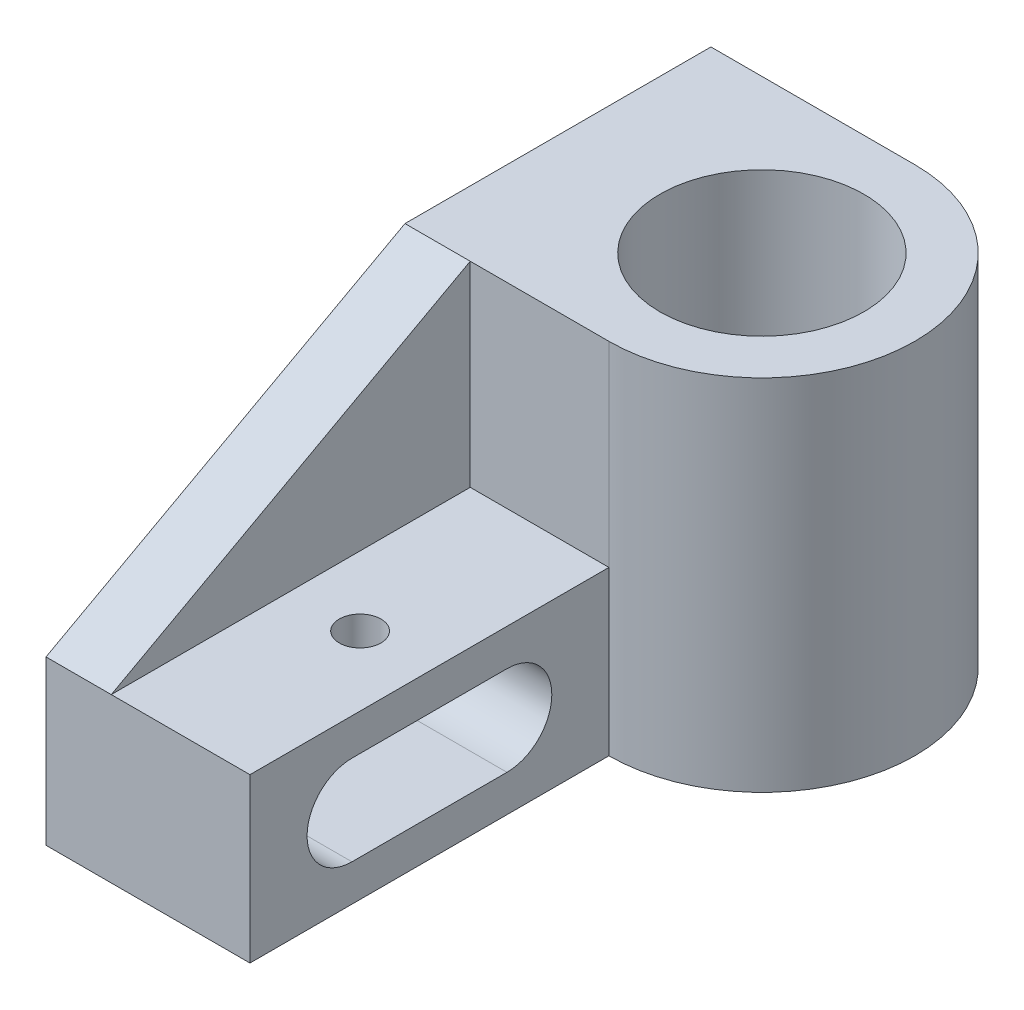
ISO-10303-21;
HEADER;
FILE_DESCRIPTION(('STEP AP214'),'2;1');
FILE_NAME('part.step','',(''),(''),'','','');
FILE_SCHEMA(('AUTOMOTIVE_DESIGN { 1 0 10303 214 1 1 1 1 }'));
ENDSEC;
DATA;
#1=APPLICATION_CONTEXT('core data for automotive mechanical design processes');
#2=APPLICATION_PROTOCOL_DEFINITION('international standard','automotive_design',2000,#1);
#3=PRODUCT_CONTEXT('',#1,'mechanical');
#4=PRODUCT('Part','Part','',(#3));
#5=PRODUCT_RELATED_PRODUCT_CATEGORY('part','',(#4));
#6=PRODUCT_DEFINITION_FORMATION('','',#4);
#7=PRODUCT_DEFINITION_CONTEXT('part definition',#1,'design');
#8=PRODUCT_DEFINITION('design','',#6,#7);
#9=PRODUCT_DEFINITION_SHAPE('','',#8);
#10=(LENGTH_UNIT() NAMED_UNIT(*) SI_UNIT(.MILLI.,.METRE.));
#11=(NAMED_UNIT(*) PLANE_ANGLE_UNIT() SI_UNIT($,.RADIAN.));
#12=(NAMED_UNIT(*) SI_UNIT($,.STERADIAN.) SOLID_ANGLE_UNIT());
#13=UNCERTAINTY_MEASURE_WITH_UNIT(LENGTH_MEASURE(1.E-05),#10,'distance_accuracy_value','');
#14=(GEOMETRIC_REPRESENTATION_CONTEXT(3) GLOBAL_UNCERTAINTY_ASSIGNED_CONTEXT((#13)) GLOBAL_UNIT_ASSIGNED_CONTEXT((#10,
#11,#12)) REPRESENTATION_CONTEXT('',''));
#15=CARTESIAN_POINT('',(0.,0.,0.));
#16=DIRECTION('',(0.,0.,1.));
#17=DIRECTION('',(1.,0.,0.));
#18=AXIS2_PLACEMENT_3D('',#15,#16,#17);
#19=CARTESIAN_POINT('',(50.,0.,-125.5));
#20=DIRECTION('',(0.,-1.,0.));
#21=DIRECTION('',(0.,0.,-1.));
#22=AXIS2_PLACEMENT_3D('',#19,#20,#21);
#23=CYLINDRICAL_SURFACE('',#22,37.5);
#24=DIRECTION('',(0.,1.,0.));
#25=VECTOR('',#24,1.);
#26=CARTESIAN_POINT('',(50.,0.,-88.));
#27=LINE('',#26,#25);
#28=CARTESIAN_POINT('',(50.,40.,-88.));
#29=VERTEX_POINT('',#28);
#30=CARTESIAN_POINT('',(50.,88.,-88.));
#31=VERTEX_POINT('',#30);
#32=EDGE_CURVE('E188',#29,#31,#27,.T.);
#33=ORIENTED_EDGE('',*,*,#32,.F.);
#34=DIRECTION('',(0.,-1.,0.));
#35=VECTOR('',#34,1.);
#36=CARTESIAN_POINT('',(50.,0.,-88.));
#37=LINE('',#36,#35);
#38=CARTESIAN_POINT('',(50.,0.,-88.));
#39=VERTEX_POINT('',#38);
#40=EDGE_CURVE('E167',#29,#39,#37,.T.);
#41=ORIENTED_EDGE('',*,*,#40,.T.);
#42=CARTESIAN_POINT('',(50.,0.,-125.5));
#43=DIRECTION('',(0.,1.,0.));
#44=DIRECTION('',(0.,0.,1.));
#45=AXIS2_PLACEMENT_3D('',#42,#43,#44);
#46=CIRCLE('',#45,37.5);
#47=CARTESIAN_POINT('',(50.,0.,-163.));
#48=VERTEX_POINT('',#47);
#49=EDGE_CURVE('E43',#48,#39,#46,.F.);
#50=ORIENTED_EDGE('',*,*,#49,.F.);
#51=DIRECTION('',(0.,1.,0.));
#52=VECTOR('',#51,1.);
#53=CARTESIAN_POINT('',(50.,0.,-163.));
#54=LINE('',#53,#52);
#55=CARTESIAN_POINT('',(50.,88.,-163.));
#56=VERTEX_POINT('',#55);
#57=EDGE_CURVE('E190',#56,#48,#54,.F.);
#58=ORIENTED_EDGE('',*,*,#57,.F.);
#59=CARTESIAN_POINT('',(50.,88.,-125.5));
#60=DIRECTION('',(0.,-1.,0.));
#61=DIRECTION('',(0.,0.,-1.));
#62=AXIS2_PLACEMENT_3D('',#59,#60,#61);
#63=CIRCLE('',#62,37.5);
#64=EDGE_CURVE('E11',#31,#56,#63,.F.);
#65=ORIENTED_EDGE('',*,*,#64,.F.);
#66=EDGE_LOOP('',(#33,#41,#50,#58,#65));
#67=FACE_BOUND('',#66,.T.);
#68=ADVANCED_FACE('F36',(#67),#23,.T.);
#69=CARTESIAN_POINT('',(87.5,0.,-88.));
#70=DIRECTION('',(0.,0.,-1.));
#71=DIRECTION('',(0.,1.,0.));
#72=AXIS2_PLACEMENT_3D('',#69,#70,#71);
#73=PLANE('',#72);
#74=DIRECTION('',(-1.,0.,0.));
#75=VECTOR('',#74,1.);
#76=CARTESIAN_POINT('',(50.,40.,-88.));
#77=LINE('',#76,#75);
#78=CARTESIAN_POINT('',(16.,40.,-88.));
#79=VERTEX_POINT('',#78);
#80=EDGE_CURVE('E147',#29,#79,#77,.T.);
#81=ORIENTED_EDGE('',*,*,#80,.F.);
#82=ORIENTED_EDGE('',*,*,#32,.T.);
#83=DIRECTION('',(-1.,0.,0.));
#84=VECTOR('',#83,1.);
#85=CARTESIAN_POINT('',(87.5,88.,-88.));
#86=LINE('',#85,#84);
#87=CARTESIAN_POINT('',(16.,88.,-88.));
#88=VERTEX_POINT('',#87);
#89=EDGE_CURVE('E183',#31,#88,#86,.T.);
#90=ORIENTED_EDGE('',*,*,#89,.T.);
#91=DIRECTION('',(0.,-1.,0.));
#92=VECTOR('',#91,1.);
#93=CARTESIAN_POINT('',(16.,0.,-88.));
#94=LINE('',#93,#92);
#95=EDGE_CURVE('E124',#88,#79,#94,.T.);
#96=ORIENTED_EDGE('',*,*,#95,.T.);
#97=EDGE_LOOP('',(#81,#82,#90,#96));
#98=FACE_BOUND('',#97,.T.);
#99=ADVANCED_FACE('F265',(#98),#73,.F.);
#100=CARTESIAN_POINT('',(87.5,88.,0.));
#101=DIRECTION('',(0.,-1.,0.));
#102=DIRECTION('',(0.,0.,-1.));
#103=AXIS2_PLACEMENT_3D('',#100,#101,#102);
#104=PLANE('',#103);
#105=CARTESIAN_POINT('',(50.,88.,-125.5));
#106=DIRECTION('',(0.,1.,0.));
#107=DIRECTION('',(0.,0.,1.));
#108=AXIS2_PLACEMENT_3D('',#105,#106,#107);
#109=CIRCLE('',#108,25.);
#110=CARTESIAN_POINT('',(50.,88.,-100.5));
#111=VERTEX_POINT('',#110);
#112=EDGE_CURVE('E320',#111,#111,#109,.T.);
#113=ORIENTED_EDGE('',*,*,#112,.F.);
#114=EDGE_LOOP('',(#113));
#115=FACE_BOUND('',#114,.T.);
#116=ORIENTED_EDGE('',*,*,#89,.F.);
#117=ORIENTED_EDGE('',*,*,#64,.T.);
#118=DIRECTION('',(-1.,0.,0.));
#119=VECTOR('',#118,1.);
#120=CARTESIAN_POINT('',(87.5,88.,-163.));
#121=LINE('',#120,#119);
#122=CARTESIAN_POINT('',(0.,88.,-163.));
#123=VERTEX_POINT('',#122);
#124=EDGE_CURVE('E178',#56,#123,#121,.T.);
#125=ORIENTED_EDGE('',*,*,#124,.T.);
#126=DIRECTION('',(0.,0.,1.));
#127=VECTOR('',#126,1.);
#128=CARTESIAN_POINT('',(0.,88.,0.));
#129=LINE('',#128,#127);
#130=CARTESIAN_POINT('',(0.,88.,-88.));
#131=VERTEX_POINT('',#130);
#132=EDGE_CURVE('E154',#123,#131,#129,.T.);
#133=ORIENTED_EDGE('',*,*,#132,.T.);
#134=DIRECTION('',(-1.,0.,0.));
#135=VECTOR('',#134,1.);
#136=CARTESIAN_POINT('',(16.,88.,-88.));
#137=LINE('',#136,#135);
#138=EDGE_CURVE('E138',#88,#131,#137,.T.);
#139=ORIENTED_EDGE('',*,*,#138,.F.);
#140=EDGE_LOOP('',(#116,#117,#125,#133,#139));
#141=FACE_BOUND('',#140,.T.);
#142=ADVANCED_FACE('F269',(#115,#141),#104,.F.);
#143=CARTESIAN_POINT('',(87.5,0.,0.));
#144=DIRECTION('',(0.,1.,0.));
#145=DIRECTION('',(0.,0.,1.));
#146=AXIS2_PLACEMENT_3D('',#143,#144,#145);
#147=PLANE('',#146);
#148=CARTESIAN_POINT('',(50.,0.,-125.5));
#149=DIRECTION('',(0.,1.,0.));
#150=DIRECTION('',(0.,0.,1.));
#151=AXIS2_PLACEMENT_3D('',#148,#149,#150);
#152=CIRCLE('',#151,25.);
#153=CARTESIAN_POINT('',(50.,0.,-100.5));
#154=VERTEX_POINT('',#153);
#155=EDGE_CURVE('E323',#154,#154,#152,.F.);
#156=ORIENTED_EDGE('',*,*,#155,.F.);
#157=EDGE_LOOP('',(#156));
#158=FACE_BOUND('',#157,.T.);
#159=DIRECTION('',(-1.,0.,0.));
#160=VECTOR('',#159,1.);
#161=CARTESIAN_POINT('',(87.5,0.,-163.));
#162=LINE('',#161,#160);
#163=CARTESIAN_POINT('',(0.,0.,-163.));
#164=VERTEX_POINT('',#163);
#165=EDGE_CURVE('E180',#48,#164,#162,.T.);
#166=ORIENTED_EDGE('',*,*,#165,.F.);
#167=ORIENTED_EDGE('',*,*,#49,.T.);
#168=DIRECTION('',(0.,0.,-1.));
#169=VECTOR('',#168,1.);
#170=CARTESIAN_POINT('',(50.,0.,0.));
#171=LINE('',#170,#169);
#172=CARTESIAN_POINT('',(50.,0.,0.));
#173=VERTEX_POINT('',#172);
#174=EDGE_CURVE('E199',#173,#39,#171,.T.);
#175=ORIENTED_EDGE('',*,*,#174,.F.);
#176=DIRECTION('',(-1.,0.,0.));
#177=VECTOR('',#176,1.);
#178=CARTESIAN_POINT('',(50.,0.,0.));
#179=LINE('',#178,#177);
#180=CARTESIAN_POINT('',(0.,0.,0.));
#181=VERTEX_POINT('',#180);
#182=EDGE_CURVE('E155',#173,#181,#179,.T.);
#183=ORIENTED_EDGE('',*,*,#182,.T.);
#184=DIRECTION('',(0.,0.,-1.));
#185=VECTOR('',#184,1.);
#186=CARTESIAN_POINT('',(0.,0.,0.));
#187=LINE('',#186,#185);
#188=EDGE_CURVE('E158',#181,#164,#187,.T.);
#189=ORIENTED_EDGE('',*,*,#188,.T.);
#190=EDGE_LOOP('',(#166,#167,#175,#183,#189));
#191=FACE_BOUND('',#190,.T.);
#192=ADVANCED_FACE('F198',(#158,#191),#147,.F.);
#193=CARTESIAN_POINT('',(87.5,1.02821791485171E-13,-163.));
#194=DIRECTION('',(0.,0.,1.));
#195=DIRECTION('',(0.,-1.,0.));
#196=AXIS2_PLACEMENT_3D('',#193,#194,#195);
#197=PLANE('',#196);
#198=ORIENTED_EDGE('',*,*,#124,.F.);
#199=ORIENTED_EDGE('',*,*,#57,.T.);
#200=ORIENTED_EDGE('',*,*,#165,.T.);
#201=DIRECTION('',(0.,1.,0.));
#202=VECTOR('',#201,1.);
#203=CARTESIAN_POINT('',(0.,1.02821791485171E-13,-163.));
#204=LINE('',#203,#202);
#205=EDGE_CURVE('E175',#164,#123,#204,.T.);
#206=ORIENTED_EDGE('',*,*,#205,.T.);
#207=EDGE_LOOP('',(#198,#199,#200,#206));
#208=FACE_BOUND('',#207,.T.);
#209=ADVANCED_FACE('F279',(#208),#197,.F.);
#210=CARTESIAN_POINT('',(0.,0.,0.));
#211=DIRECTION('',(1.,0.,0.));
#212=DIRECTION('',(0.,0.,-1.));
#213=AXIS2_PLACEMENT_3D('',#210,#211,#212);
#214=PLANE('',#213);
#215=ORIENTED_EDGE('',*,*,#132,.F.);
#216=ORIENTED_EDGE('',*,*,#205,.F.);
#217=ORIENTED_EDGE('',*,*,#188,.F.);
#218=DIRECTION('',(0.,-1.,0.));
#219=VECTOR('',#218,1.);
#220=CARTESIAN_POINT('',(0.,0.,0.));
#221=LINE('',#220,#219);
#222=CARTESIAN_POINT('',(0.,40.,0.));
#223=VERTEX_POINT('',#222);
#224=EDGE_CURVE('E221',#223,#181,#221,.T.);
#225=ORIENTED_EDGE('',*,*,#224,.F.);
#226=DIRECTION('',(0.,-0.478852130680573,0.877895572914384));
#227=VECTOR('',#226,1.);
#228=CARTESIAN_POINT('',(0.,30.828025477707,16.8152866242038));
#229=LINE('',#228,#227);
#230=EDGE_CURVE('E127',#131,#223,#229,.T.);
#231=ORIENTED_EDGE('',*,*,#230,.F.);
#232=EDGE_LOOP('',(#215,#216,#217,#225,#231));
#233=FACE_BOUND('',#232,.T.);
#234=CARTESIAN_POINT('',(0.,20.,-63.));
#235=DIRECTION('',(1.,0.,0.));
#236=DIRECTION('',(0.,0.,-1.));
#237=AXIS2_PLACEMENT_3D('',#234,#235,#236);
#238=CIRCLE('',#237,11.);
#239=CARTESIAN_POINT('',(0.,8.99999999999999,-63.));
#240=VERTEX_POINT('',#239);
#241=CARTESIAN_POINT('',(0.,31.,-63.));
#242=VERTEX_POINT('',#241);
#243=EDGE_CURVE('E137',#240,#242,#238,.T.);
#244=ORIENTED_EDGE('',*,*,#243,.T.);
#245=DIRECTION('',(0.,0.,-1.));
#246=VECTOR('',#245,1.);
#247=CARTESIAN_POINT('',(0.,31.,0.));
#248=LINE('',#247,#246);
#249=CARTESIAN_POINT('',(0.,31.,-25.));
#250=VERTEX_POINT('',#249);
#251=EDGE_CURVE('E219',#250,#242,#248,.T.);
#252=ORIENTED_EDGE('',*,*,#251,.F.);
#253=CARTESIAN_POINT('',(0.,20.,-25.));
#254=DIRECTION('',(1.,0.,0.));
#255=DIRECTION('',(0.,0.,-1.));
#256=AXIS2_PLACEMENT_3D('',#253,#254,#255);
#257=CIRCLE('',#256,11.);
#258=CARTESIAN_POINT('',(0.,8.99999999999999,-25.));
#259=VERTEX_POINT('',#258);
#260=EDGE_CURVE('E216',#250,#259,#257,.T.);
#261=ORIENTED_EDGE('',*,*,#260,.T.);
#262=DIRECTION('',(0.,0.,-1.));
#263=VECTOR('',#262,1.);
#264=CARTESIAN_POINT('',(0.,9.,0.));
#265=LINE('',#264,#263);
#266=EDGE_CURVE('E213',#259,#240,#265,.T.);
#267=ORIENTED_EDGE('',*,*,#266,.T.);
#268=EDGE_LOOP('',(#244,#252,#261,#267));
#269=FACE_BOUND('',#268,.T.);
#270=ADVANCED_FACE('F249',(#233,#269),#214,.F.);
#271=CARTESIAN_POINT('',(50.,40.,0.));
#272=DIRECTION('',(0.,1.,0.));
#273=DIRECTION('',(0.,0.,1.));
#274=AXIS2_PLACEMENT_3D('',#271,#272,#273);
#275=PLANE('',#274);
#276=CARTESIAN_POINT('',(33.,40.,-44.));
#277=DIRECTION('',(0.,1.,0.));
#278=DIRECTION('',(0.,0.,1.));
#279=AXIS2_PLACEMENT_3D('',#276,#277,#278);
#280=CIRCLE('',#279,5.1);
#281=CARTESIAN_POINT('',(33.,40.,-38.9));
#282=VERTEX_POINT('',#281);
#283=EDGE_CURVE('E316',#282,#282,#280,.F.);
#284=ORIENTED_EDGE('',*,*,#283,.T.);
#285=EDGE_LOOP('',(#284));
#286=FACE_BOUND('',#285,.T.);
#287=DIRECTION('',(0.,0.,-1.));
#288=VECTOR('',#287,1.);
#289=CARTESIAN_POINT('',(16.,40.,0.));
#290=LINE('',#289,#288);
#291=CARTESIAN_POINT('',(16.,40.,0.));
#292=VERTEX_POINT('',#291);
#293=EDGE_CURVE('E122',#292,#79,#290,.T.);
#294=ORIENTED_EDGE('',*,*,#293,.F.);
#295=DIRECTION('',(-1.,0.,0.));
#296=VECTOR('',#295,1.);
#297=CARTESIAN_POINT('',(50.,40.,0.));
#298=LINE('',#297,#296);
#299=CARTESIAN_POINT('',(50.,40.,0.));
#300=VERTEX_POINT('',#299);
#301=EDGE_CURVE('E144',#300,#292,#298,.T.);
#302=ORIENTED_EDGE('',*,*,#301,.F.);
#303=DIRECTION('',(0.,0.,-1.));
#304=VECTOR('',#303,1.);
#305=CARTESIAN_POINT('',(50.,40.,0.));
#306=LINE('',#305,#304);
#307=EDGE_CURVE('E236',#300,#29,#306,.T.);
#308=ORIENTED_EDGE('',*,*,#307,.T.);
#309=ORIENTED_EDGE('',*,*,#80,.T.);
#310=EDGE_LOOP('',(#294,#302,#308,#309));
#311=FACE_BOUND('',#310,.T.);
#312=ADVANCED_FACE('F142',(#286,#311),#275,.T.);
#313=CARTESIAN_POINT('',(50.,0.,0.));
#314=DIRECTION('',(0.,0.,-1.));
#315=DIRECTION('',(0.,1.,0.));
#316=AXIS2_PLACEMENT_3D('',#313,#314,#315);
#317=PLANE('',#316);
#318=ORIENTED_EDGE('',*,*,#224,.T.);
#319=ORIENTED_EDGE('',*,*,#182,.F.);
#320=DIRECTION('',(0.,-1.,0.));
#321=VECTOR('',#320,1.);
#322=CARTESIAN_POINT('',(50.,0.,0.));
#323=LINE('',#322,#321);
#324=EDGE_CURVE('E152',#300,#173,#323,.T.);
#325=ORIENTED_EDGE('',*,*,#324,.F.);
#326=ORIENTED_EDGE('',*,*,#301,.T.);
#327=DIRECTION('',(-1.,0.,0.));
#328=VECTOR('',#327,1.);
#329=CARTESIAN_POINT('',(16.,40.,0.));
#330=LINE('',#329,#328);
#331=EDGE_CURVE('E130',#292,#223,#330,.T.);
#332=ORIENTED_EDGE('',*,*,#331,.T.);
#333=EDGE_LOOP('',(#318,#319,#325,#326,#332));
#334=FACE_BOUND('',#333,.T.);
#335=ADVANCED_FACE('F149',(#334),#317,.F.);
#336=CARTESIAN_POINT('',(50.,20.,-63.));
#337=DIRECTION('',(-1.,0.,0.));
#338=DIRECTION('',(0.,0.,1.));
#339=AXIS2_PLACEMENT_3D('',#336,#337,#338);
#340=CYLINDRICAL_SURFACE('',#339,11.);
#341=ORIENTED_EDGE('',*,*,#243,.F.);
#342=DIRECTION('',(-1.,0.,0.));
#343=VECTOR('',#342,1.);
#344=CARTESIAN_POINT('',(50.,8.99999999999999,-63.));
#345=LINE('',#344,#343);
#346=CARTESIAN_POINT('',(50.,8.99999999999999,-63.));
#347=VERTEX_POINT('',#346);
#348=EDGE_CURVE('E171',#347,#240,#345,.T.);
#349=ORIENTED_EDGE('',*,*,#348,.F.);
#350=CARTESIAN_POINT('',(50.,20.,-63.));
#351=DIRECTION('',(1.,0.,0.));
#352=DIRECTION('',(0.,0.,-1.));
#353=AXIS2_PLACEMENT_3D('',#350,#351,#352);
#354=CIRCLE('',#353,11.);
#355=CARTESIAN_POINT('',(50.,31.,-63.));
#356=VERTEX_POINT('',#355);
#357=EDGE_CURVE('E222',#347,#356,#354,.T.);
#358=ORIENTED_EDGE('',*,*,#357,.T.);
#359=DIRECTION('',(-1.,0.,0.));
#360=VECTOR('',#359,1.);
#361=CARTESIAN_POINT('',(50.,31.,-63.));
#362=LINE('',#361,#360);
#363=EDGE_CURVE('E164',#356,#242,#362,.T.);
#364=ORIENTED_EDGE('',*,*,#363,.T.);
#365=EDGE_LOOP('',(#341,#349,#358,#364));
#366=FACE_BOUND('',#365,.T.);
#367=ADVANCED_FACE('F246',(#366),#340,.F.);
#368=CARTESIAN_POINT('',(50.,9.,0.));
#369=DIRECTION('',(0.,1.,0.));
#370=DIRECTION('',(0.,0.,1.));
#371=AXIS2_PLACEMENT_3D('',#368,#369,#370);
#372=PLANE('',#371);
#373=ORIENTED_EDGE('',*,*,#266,.F.);
#374=DIRECTION('',(-1.,0.,0.));
#375=VECTOR('',#374,1.);
#376=CARTESIAN_POINT('',(50.,8.99999999999999,-25.));
#377=LINE('',#376,#375);
#378=CARTESIAN_POINT('',(50.,8.99999999999999,-25.));
#379=VERTEX_POINT('',#378);
#380=EDGE_CURVE('E169',#379,#259,#377,.T.);
#381=ORIENTED_EDGE('',*,*,#380,.F.);
#382=DIRECTION('',(0.,0.,-1.));
#383=VECTOR('',#382,1.);
#384=CARTESIAN_POINT('',(50.,9.,0.));
#385=LINE('',#384,#383);
#386=EDGE_CURVE('E224',#379,#347,#385,.T.);
#387=ORIENTED_EDGE('',*,*,#386,.T.);
#388=ORIENTED_EDGE('',*,*,#348,.T.);
#389=EDGE_LOOP('',(#373,#381,#387,#388));
#390=FACE_BOUND('',#389,.T.);
#391=ADVANCED_FACE('F252',(#390),#372,.T.);
#392=CARTESIAN_POINT('',(50.,20.,-25.));
#393=DIRECTION('',(-1.,0.,0.));
#394=DIRECTION('',(0.,0.,1.));
#395=AXIS2_PLACEMENT_3D('',#392,#393,#394);
#396=CYLINDRICAL_SURFACE('',#395,11.);
#397=ORIENTED_EDGE('',*,*,#260,.F.);
#398=DIRECTION('',(-1.,0.,0.));
#399=VECTOR('',#398,1.);
#400=CARTESIAN_POINT('',(50.,31.,-25.));
#401=LINE('',#400,#399);
#402=CARTESIAN_POINT('',(50.,31.,-25.));
#403=VERTEX_POINT('',#402);
#404=EDGE_CURVE('E166',#403,#250,#401,.T.);
#405=ORIENTED_EDGE('',*,*,#404,.F.);
#406=CARTESIAN_POINT('',(50.,20.,-25.));
#407=DIRECTION('',(1.,0.,0.));
#408=DIRECTION('',(0.,0.,-1.));
#409=AXIS2_PLACEMENT_3D('',#406,#407,#408);
#410=CIRCLE('',#409,11.);
#411=EDGE_CURVE('E229',#403,#379,#410,.T.);
#412=ORIENTED_EDGE('',*,*,#411,.T.);
#413=ORIENTED_EDGE('',*,*,#380,.T.);
#414=EDGE_LOOP('',(#397,#405,#412,#413));
#415=FACE_BOUND('',#414,.T.);
#416=ADVANCED_FACE('F254',(#415),#396,.F.);
#417=CARTESIAN_POINT('',(50.,31.,0.));
#418=DIRECTION('',(0.,1.,0.));
#419=DIRECTION('',(0.,0.,1.));
#420=AXIS2_PLACEMENT_3D('',#417,#418,#419);
#421=PLANE('',#420);
#422=CARTESIAN_POINT('',(33.,31.,-44.));
#423=DIRECTION('',(0.,1.,0.));
#424=DIRECTION('',(0.,0.,1.));
#425=AXIS2_PLACEMENT_3D('',#422,#423,#424);
#426=CIRCLE('',#425,5.1);
#427=CARTESIAN_POINT('',(33.,31.,-38.9));
#428=VERTEX_POINT('',#427);
#429=EDGE_CURVE('E319',#428,#428,#426,.F.);
#430=ORIENTED_EDGE('',*,*,#429,.F.);
#431=EDGE_LOOP('',(#430));
#432=FACE_BOUND('',#431,.T.);
#433=ORIENTED_EDGE('',*,*,#251,.T.);
#434=ORIENTED_EDGE('',*,*,#363,.F.);
#435=DIRECTION('',(0.,0.,-1.));
#436=VECTOR('',#435,1.);
#437=CARTESIAN_POINT('',(50.,31.,0.));
#438=LINE('',#437,#436);
#439=EDGE_CURVE('E235',#403,#356,#438,.T.);
#440=ORIENTED_EDGE('',*,*,#439,.F.);
#441=ORIENTED_EDGE('',*,*,#404,.T.);
#442=EDGE_LOOP('',(#433,#434,#440,#441));
#443=FACE_BOUND('',#442,.T.);
#444=ADVANCED_FACE('F243',(#432,#443),#421,.F.);
#445=CARTESIAN_POINT('',(50.,0.,0.));
#446=DIRECTION('',(1.,0.,0.));
#447=DIRECTION('',(0.,0.,-1.));
#448=AXIS2_PLACEMENT_3D('',#445,#446,#447);
#449=PLANE('',#448);
#450=ORIENTED_EDGE('',*,*,#357,.F.);
#451=ORIENTED_EDGE('',*,*,#386,.F.);
#452=ORIENTED_EDGE('',*,*,#411,.F.);
#453=ORIENTED_EDGE('',*,*,#439,.T.);
#454=EDGE_LOOP('',(#450,#451,#452,#453));
#455=FACE_BOUND('',#454,.T.);
#456=ORIENTED_EDGE('',*,*,#307,.F.);
#457=ORIENTED_EDGE('',*,*,#324,.T.);
#458=ORIENTED_EDGE('',*,*,#174,.T.);
#459=ORIENTED_EDGE('',*,*,#40,.F.);
#460=EDGE_LOOP('',(#456,#457,#458,#459));
#461=FACE_BOUND('',#460,.T.);
#462=ADVANCED_FACE('F202',(#455,#461),#449,.T.);
#463=CARTESIAN_POINT('',(16.,30.828025477707,16.8152866242038));
#464=DIRECTION('',(0.,-0.877895572914384,-0.478852130680573));
#465=DIRECTION('',(0.,0.478852130680573,-0.877895572914384));
#466=AXIS2_PLACEMENT_3D('',#463,#464,#465);
#467=PLANE('',#466);
#468=ORIENTED_EDGE('',*,*,#230,.T.);
#469=ORIENTED_EDGE('',*,*,#331,.F.);
#470=DIRECTION('',(0.,-0.478852130680573,0.877895572914384));
#471=VECTOR('',#470,1.);
#472=CARTESIAN_POINT('',(16.,30.828025477707,16.8152866242038));
#473=LINE('',#472,#471);
#474=EDGE_CURVE('E118',#88,#292,#473,.T.);
#475=ORIENTED_EDGE('',*,*,#474,.F.);
#476=ORIENTED_EDGE('',*,*,#138,.T.);
#477=EDGE_LOOP('',(#468,#469,#475,#476));
#478=FACE_BOUND('',#477,.T.);
#479=ADVANCED_FACE('F131',(#478),#467,.F.);
#480=CARTESIAN_POINT('',(16.,0.,0.));
#481=DIRECTION('',(1.,0.,0.));
#482=DIRECTION('',(0.,0.,-1.));
#483=AXIS2_PLACEMENT_3D('',#480,#481,#482);
#484=PLANE('',#483);
#485=ORIENTED_EDGE('',*,*,#474,.T.);
#486=ORIENTED_EDGE('',*,*,#293,.T.);
#487=ORIENTED_EDGE('',*,*,#95,.F.);
#488=EDGE_LOOP('',(#485,#486,#487));
#489=FACE_BOUND('',#488,.T.);
#490=ADVANCED_FACE('F120',(#489),#484,.T.);
#491=CARTESIAN_POINT('',(50.,-0.00110000000003163,-125.5));
#492=DIRECTION('',(0.,1.,0.));
#493=DIRECTION('',(0.,0.,1.));
#494=AXIS2_PLACEMENT_3D('',#491,#492,#493);
#495=CYLINDRICAL_SURFACE('',#494,25.);
#496=ORIENTED_EDGE('',*,*,#112,.T.);
#497=EDGE_LOOP('',(#496));
#498=FACE_BOUND('',#497,.T.);
#499=ORIENTED_EDGE('',*,*,#155,.T.);
#500=EDGE_LOOP('',(#499));
#501=FACE_BOUND('',#500,.T.);
#502=ADVANCED_FACE('F304',(#498,#501),#495,.F.);
#503=CARTESIAN_POINT('',(33.,-0.00110000000004551,-44.));
#504=DIRECTION('',(0.,1.,0.));
#505=DIRECTION('',(0.,0.,1.));
#506=AXIS2_PLACEMENT_3D('',#503,#504,#505);
#507=CYLINDRICAL_SURFACE('',#506,5.1);
#508=ORIENTED_EDGE('',*,*,#283,.F.);
#509=EDGE_LOOP('',(#508));
#510=FACE_BOUND('',#509,.T.);
#511=ORIENTED_EDGE('',*,*,#429,.T.);
#512=EDGE_LOOP('',(#511));
#513=FACE_BOUND('',#512,.T.);
#514=ADVANCED_FACE('F307',(#510,#513),#507,.F.);
#515=CLOSED_SHELL('',(#68,#99,#142,#192,#209,#270,#312,#335,#367,#391,#416,#444,#462,#479,#490,
#502,#514));
#516=MANIFOLD_SOLID_BREP('B2',#515);
#517=ADVANCED_BREP_SHAPE_REPRESENTATION('',(#18,#516),#14);
#518=SHAPE_DEFINITION_REPRESENTATION(#9,#517);
ENDSEC;
END-ISO-10303-21;
